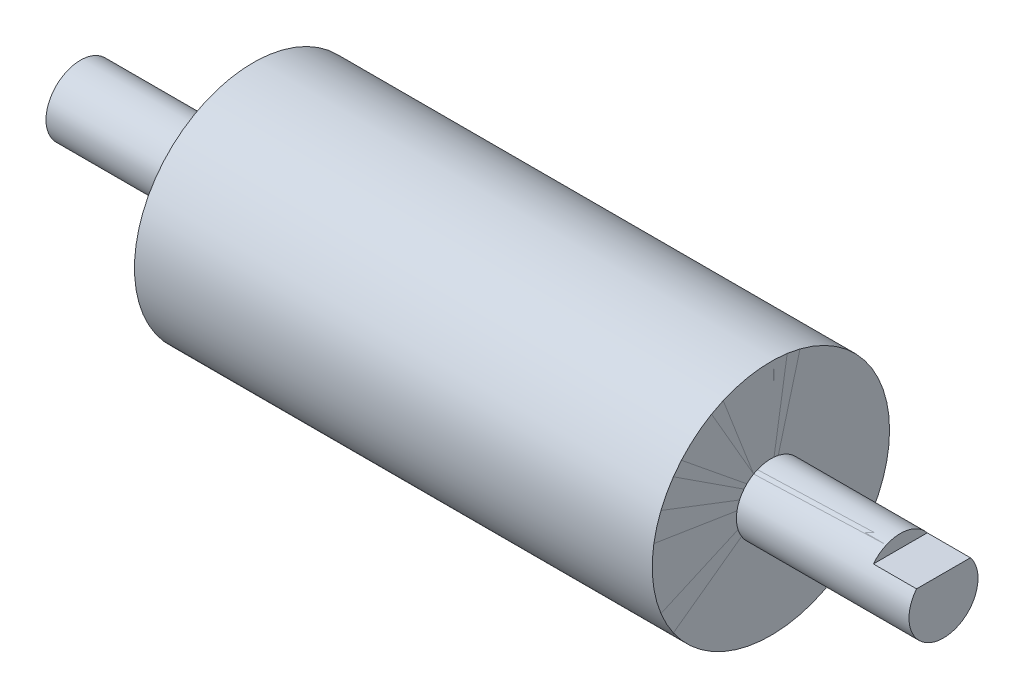
ISO-10303-21;
HEADER;
FILE_DESCRIPTION(('STEP AP214'),'2;1');
FILE_NAME('part.step','',(''),(''),'','','');
FILE_SCHEMA(('AUTOMOTIVE_DESIGN { 1 0 10303 214 1 1 1 1 }'));
ENDSEC;
DATA;
#1=APPLICATION_CONTEXT('core data for automotive mechanical design processes');
#2=APPLICATION_PROTOCOL_DEFINITION('international standard','automotive_design',2000,#1);
#3=PRODUCT_CONTEXT('',#1,'mechanical');
#4=PRODUCT('Part','Part','',(#3));
#5=PRODUCT_RELATED_PRODUCT_CATEGORY('part','',(#4));
#6=PRODUCT_DEFINITION_FORMATION('','',#4);
#7=PRODUCT_DEFINITION_CONTEXT('part definition',#1,'design');
#8=PRODUCT_DEFINITION('design','',#6,#7);
#9=PRODUCT_DEFINITION_SHAPE('','',#8);
#10=(LENGTH_UNIT() NAMED_UNIT(*) SI_UNIT(.MILLI.,.METRE.));
#11=(NAMED_UNIT(*) PLANE_ANGLE_UNIT() SI_UNIT($,.RADIAN.));
#12=(NAMED_UNIT(*) SI_UNIT($,.STERADIAN.) SOLID_ANGLE_UNIT());
#13=UNCERTAINTY_MEASURE_WITH_UNIT(LENGTH_MEASURE(1.E-05),#10,'distance_accuracy_value','');
#14=(GEOMETRIC_REPRESENTATION_CONTEXT(3) GLOBAL_UNCERTAINTY_ASSIGNED_CONTEXT((#13)) GLOBAL_UNIT_ASSIGNED_CONTEXT((#10,
#11,#12)) REPRESENTATION_CONTEXT('',''));
#15=CARTESIAN_POINT('',(0.,0.,0.));
#16=DIRECTION('',(0.,0.,1.));
#17=DIRECTION('',(1.,0.,0.));
#18=AXIS2_PLACEMENT_3D('',#15,#16,#17);
#19=CARTESIAN_POINT('',(0.,0.,0.));
#20=DIRECTION('',(1.,0.,0.));
#21=DIRECTION('',(0.,0.,-1.));
#22=AXIS2_PLACEMENT_3D('',#19,#20,#21);
#23=PLANE('',#22);
#24=CARTESIAN_POINT('',(0.,0.,0.));
#25=DIRECTION('',(1.,0.,0.));
#26=DIRECTION('',(0.,0.,-1.));
#27=AXIS2_PLACEMENT_3D('',#24,#25,#26);
#28=CIRCLE('',#27,8.);
#29=CARTESIAN_POINT('',(0.,0.,-8.));
#30=VERTEX_POINT('',#29);
#31=EDGE_CURVE('E98',#30,#30,#28,.F.);
#32=ORIENTED_EDGE('',*,*,#31,.T.);
#33=EDGE_LOOP('',(#32));
#34=FACE_BOUND('',#33,.T.);
#35=CARTESIAN_POINT('',(0.,0.,0.));
#36=DIRECTION('',(1.,0.,0.));
#37=DIRECTION('',(0.,0.,-1.));
#38=AXIS2_PLACEMENT_3D('',#35,#36,#37);
#39=CIRCLE('',#38,27.5);
#40=CARTESIAN_POINT('',(0.,0.,-27.5));
#41=VERTEX_POINT('',#40);
#42=EDGE_CURVE('E12',#41,#41,#39,.T.);
#43=ORIENTED_EDGE('',*,*,#42,.T.);
#44=EDGE_LOOP('',(#43));
#45=FACE_BOUND('',#44,.T.);
#46=ADVANCED_FACE('F53',(#34,#45),#23,.T.);
#47=CARTESIAN_POINT('',(0.,0.,0.));
#48=DIRECTION('',(1.,0.,0.));
#49=DIRECTION('',(0.,0.,-1.));
#50=AXIS2_PLACEMENT_3D('',#47,#48,#49);
#51=CYLINDRICAL_SURFACE('',#50,27.5);
#52=CARTESIAN_POINT('',(-120.,0.,0.));
#53=DIRECTION('',(1.,0.,0.));
#54=DIRECTION('',(0.,0.,-1.));
#55=AXIS2_PLACEMENT_3D('',#52,#53,#54);
#56=CIRCLE('',#55,27.5);
#57=CARTESIAN_POINT('',(-120.,0.,-27.5));
#58=VERTEX_POINT('',#57);
#59=EDGE_CURVE('E61',#58,#58,#56,.T.);
#60=ORIENTED_EDGE('',*,*,#59,.T.);
#61=EDGE_LOOP('',(#60));
#62=FACE_BOUND('',#61,.T.);
#63=ORIENTED_EDGE('',*,*,#42,.F.);
#64=EDGE_LOOP('',(#63));
#65=FACE_BOUND('',#64,.T.);
#66=ADVANCED_FACE('F104',(#62,#65),#51,.T.);
#67=CARTESIAN_POINT('',(-120.,0.,0.));
#68=DIRECTION('',(-1.,0.,0.));
#69=DIRECTION('',(0.,0.,1.));
#70=AXIS2_PLACEMENT_3D('',#67,#68,#69);
#71=PLANE('',#70);
#72=CARTESIAN_POINT('',(-120.,0.,0.));
#73=DIRECTION('',(-1.,0.,0.));
#74=DIRECTION('',(0.,0.,1.));
#75=AXIS2_PLACEMENT_3D('',#72,#73,#74);
#76=CIRCLE('',#75,8.);
#77=CARTESIAN_POINT('',(-120.,0.,8.));
#78=VERTEX_POINT('',#77);
#79=EDGE_CURVE('E56',#78,#78,#76,.F.);
#80=ORIENTED_EDGE('',*,*,#79,.T.);
#81=EDGE_LOOP('',(#80));
#82=FACE_BOUND('',#81,.T.);
#83=ORIENTED_EDGE('',*,*,#59,.F.);
#84=EDGE_LOOP('',(#83));
#85=FACE_BOUND('',#84,.T.);
#86=ADVANCED_FACE('F107',(#82,#85),#71,.T.);
#87=CARTESIAN_POINT('',(-160.,0.,0.));
#88=DIRECTION('',(-1.,0.,0.));
#89=DIRECTION('',(0.,0.,1.));
#90=AXIS2_PLACEMENT_3D('',#87,#88,#89);
#91=PLANE('',#90);
#92=CARTESIAN_POINT('',(-160.,0.,0.));
#93=DIRECTION('',(-1.,0.,0.));
#94=DIRECTION('',(0.,0.,1.));
#95=AXIS2_PLACEMENT_3D('',#92,#93,#94);
#96=CIRCLE('',#95,8.);
#97=CARTESIAN_POINT('',(-160.,0.,8.));
#98=VERTEX_POINT('',#97);
#99=EDGE_CURVE('E85',#98,#98,#96,.T.);
#100=ORIENTED_EDGE('',*,*,#99,.T.);
#101=EDGE_LOOP('',(#100));
#102=FACE_BOUND('',#101,.T.);
#103=ADVANCED_FACE('F109',(#102),#91,.T.);
#104=CARTESIAN_POINT('',(-160.,0.,0.));
#105=DIRECTION('',(1.,0.,0.));
#106=DIRECTION('',(0.,0.,-1.));
#107=AXIS2_PLACEMENT_3D('',#104,#105,#106);
#108=CYLINDRICAL_SURFACE('',#107,8.);
#109=ORIENTED_EDGE('',*,*,#79,.F.);
#110=EDGE_LOOP('',(#109));
#111=FACE_BOUND('',#110,.T.);
#112=ORIENTED_EDGE('',*,*,#99,.F.);
#113=EDGE_LOOP('',(#112));
#114=FACE_BOUND('',#113,.T.);
#115=ADVANCED_FACE('F116',(#111,#114),#108,.T.);
#116=ORIENTED_EDGE('',*,*,#31,.F.);
#117=EDGE_LOOP('',(#116));
#118=FACE_BOUND('',#117,.T.);
#119=CARTESIAN_POINT('',(30.,0.,0.));
#120=DIRECTION('',(1.,0.,0.));
#121=DIRECTION('',(0.,0.,-1.));
#122=AXIS2_PLACEMENT_3D('',#119,#120,#121);
#123=CIRCLE('',#122,8.);
#124=CARTESIAN_POINT('',(30.,5.,-6.2449979983984));
#125=VERTEX_POINT('',#124);
#126=CARTESIAN_POINT('',(30.,5.,6.2449979983984));
#127=VERTEX_POINT('',#126);
#128=EDGE_CURVE('E84',#125,#127,#123,.T.);
#129=ORIENTED_EDGE('',*,*,#128,.F.);
#130=DIRECTION('',(1.,0.,0.));
#131=VECTOR('',#130,1.);
#132=CARTESIAN_POINT('',(-160.,5.,-6.2449979983984));
#133=LINE('',#132,#131);
#134=CARTESIAN_POINT('',(40.,5.,-6.24499799839839));
#135=VERTEX_POINT('',#134);
#136=EDGE_CURVE('E73',#125,#135,#133,.T.);
#137=ORIENTED_EDGE('',*,*,#136,.T.);
#138=CARTESIAN_POINT('',(40.,0.,0.));
#139=DIRECTION('',(-1.,0.,0.));
#140=DIRECTION('',(0.,0.,1.));
#141=AXIS2_PLACEMENT_3D('',#138,#139,#140);
#142=CIRCLE('',#141,8.);
#143=CARTESIAN_POINT('',(40.,5.,6.2449979983984));
#144=VERTEX_POINT('',#143);
#145=EDGE_CURVE('E90',#135,#144,#142,.T.);
#146=ORIENTED_EDGE('',*,*,#145,.T.);
#147=DIRECTION('',(1.,0.,0.));
#148=VECTOR('',#147,1.);
#149=CARTESIAN_POINT('',(-160.,5.,6.2449979983984));
#150=LINE('',#149,#148);
#151=EDGE_CURVE('E68',#144,#127,#150,.F.);
#152=ORIENTED_EDGE('',*,*,#151,.T.);
#153=EDGE_LOOP('',(#129,#137,#146,#152));
#154=FACE_BOUND('',#153,.T.);
#155=ADVANCED_FACE('F89',(#118,#154),#108,.T.);
#156=CARTESIAN_POINT('',(40.,0.,0.));
#157=DIRECTION('',(-1.,0.,0.));
#158=DIRECTION('',(0.,0.,1.));
#159=AXIS2_PLACEMENT_3D('',#156,#157,#158);
#160=PLANE('',#159);
#161=ORIENTED_EDGE('',*,*,#145,.F.);
#162=DIRECTION('',(0.,0.,1.));
#163=VECTOR('',#162,1.);
#164=CARTESIAN_POINT('',(40.,5.,0.));
#165=LINE('',#164,#163);
#166=EDGE_CURVE('E79',#135,#144,#165,.T.);
#167=ORIENTED_EDGE('',*,*,#166,.T.);
#168=EDGE_LOOP('',(#161,#167));
#169=FACE_BOUND('',#168,.T.);
#170=ADVANCED_FACE('F92',(#169),#160,.F.);
#171=CARTESIAN_POINT('',(30.,0.,0.));
#172=DIRECTION('',(1.,0.,0.));
#173=DIRECTION('',(0.,0.,-1.));
#174=AXIS2_PLACEMENT_3D('',#171,#172,#173);
#175=PLANE('',#174);
#176=ORIENTED_EDGE('',*,*,#128,.T.);
#177=DIRECTION('',(0.,0.,-1.));
#178=VECTOR('',#177,1.);
#179=CARTESIAN_POINT('',(30.,5.,13.));
#180=LINE('',#179,#178);
#181=EDGE_CURVE('E144',#127,#125,#180,.T.);
#182=ORIENTED_EDGE('',*,*,#181,.T.);
#183=EDGE_LOOP('',(#176,#182));
#184=FACE_BOUND('',#183,.T.);
#185=ADVANCED_FACE('F134',(#184),#175,.T.);
#186=CARTESIAN_POINT('',(30.,5.,13.));
#187=DIRECTION('',(0.,-1.,0.));
#188=DIRECTION('',(0.,0.,-1.));
#189=AXIS2_PLACEMENT_3D('',#186,#187,#188);
#190=PLANE('',#189);
#191=ORIENTED_EDGE('',*,*,#181,.F.);
#192=ORIENTED_EDGE('',*,*,#151,.F.);
#193=ORIENTED_EDGE('',*,*,#166,.F.);
#194=ORIENTED_EDGE('',*,*,#136,.F.);
#195=EDGE_LOOP('',(#191,#192,#193,#194));
#196=FACE_BOUND('',#195,.T.);
#197=ADVANCED_FACE('F80',(#196),#190,.F.);
#198=CLOSED_SHELL('',(#46,#66,#86,#103,#115,#155,#170,#185,#197));
#199=MANIFOLD_SOLID_BREP('B2_NOT_SHOWN',#198);
#200=CARTESIAN_POINT('',(-160.,0.,0.));
#201=DIRECTION('',(1.,0.,0.));
#202=DIRECTION('',(0.,0.,-1.));
#203=AXIS2_PLACEMENT_3D('',#200,#201,#202);
#204=CYLINDRICAL_SURFACE('',#203,8.);
#205=CARTESIAN_POINT('',(0.,0.,0.));
#206=DIRECTION('',(1.,0.,0.));
#207=DIRECTION('',(0.,0.,-1.));
#208=AXIS2_PLACEMENT_3D('',#205,#206,#207);
#209=CIRCLE('',#208,8.);
#210=CARTESIAN_POINT('',(0.,0.,-8.));
#211=VERTEX_POINT('',#210);
#212=EDGE_CURVE('E211',#211,#211,#209,.T.);
#213=ORIENTED_EDGE('',*,*,#212,.T.);
#214=EDGE_LOOP('',(#213));
#215=FACE_BOUND('',#214,.T.);
#216=CARTESIAN_POINT('',(30.,0.,0.));
#217=DIRECTION('',(1.,0.,0.));
#218=DIRECTION('',(0.,0.,-1.));
#219=AXIS2_PLACEMENT_3D('',#216,#217,#218);
#220=CIRCLE('',#219,8.);
#221=CARTESIAN_POINT('',(30.,5.,-6.2449979983984));
#222=VERTEX_POINT('',#221);
#223=CARTESIAN_POINT('',(30.,5.,6.2449979983984));
#224=VERTEX_POINT('',#223);
#225=EDGE_CURVE('E51',#222,#224,#220,.T.);
#226=ORIENTED_EDGE('',*,*,#225,.F.);
#227=DIRECTION('',(1.,0.,0.));
#228=VECTOR('',#227,1.);
#229=CARTESIAN_POINT('',(-160.,5.,-6.2449979983984));
#230=LINE('',#229,#228);
#231=CARTESIAN_POINT('',(40.,5.,-6.24499799839839));
#232=VERTEX_POINT('',#231);
#233=EDGE_CURVE('E229',#222,#232,#230,.T.);
#234=ORIENTED_EDGE('',*,*,#233,.T.);
#235=CARTESIAN_POINT('',(40.,0.,0.));
#236=DIRECTION('',(-1.,0.,0.));
#237=DIRECTION('',(0.,0.,1.));
#238=AXIS2_PLACEMENT_3D('',#235,#236,#237);
#239=CIRCLE('',#238,8.);
#240=CARTESIAN_POINT('',(40.,5.,6.2449979983984));
#241=VERTEX_POINT('',#240);
#242=EDGE_CURVE('E242',#232,#241,#239,.T.);
#243=ORIENTED_EDGE('',*,*,#242,.T.);
#244=DIRECTION('',(1.,0.,0.));
#245=VECTOR('',#244,1.);
#246=CARTESIAN_POINT('',(-160.,5.,6.2449979983984));
#247=LINE('',#246,#245);
#248=EDGE_CURVE('E224',#241,#224,#247,.F.);
#249=ORIENTED_EDGE('',*,*,#248,.T.);
#250=EDGE_LOOP('',(#226,#234,#243,#249));
#251=FACE_BOUND('',#250,.T.);
#252=ADVANCED_FACE('F207',(#215,#251),#204,.T.);
#253=CARTESIAN_POINT('',(40.,0.,0.));
#254=DIRECTION('',(-1.,0.,0.));
#255=DIRECTION('',(0.,0.,1.));
#256=AXIS2_PLACEMENT_3D('',#253,#254,#255);
#257=PLANE('',#256);
#258=ORIENTED_EDGE('',*,*,#242,.F.);
#259=DIRECTION('',(0.,0.,1.));
#260=VECTOR('',#259,1.);
#261=CARTESIAN_POINT('',(40.,5.,0.));
#262=LINE('',#261,#260);
#263=EDGE_CURVE('E216',#232,#241,#262,.T.);
#264=ORIENTED_EDGE('',*,*,#263,.T.);
#265=EDGE_LOOP('',(#258,#264));
#266=FACE_BOUND('',#265,.T.);
#267=ADVANCED_FACE('F244',(#266),#257,.F.);
#268=CARTESIAN_POINT('',(30.,0.,0.));
#269=DIRECTION('',(1.,0.,0.));
#270=DIRECTION('',(0.,0.,-1.));
#271=AXIS2_PLACEMENT_3D('',#268,#269,#270);
#272=PLANE('',#271);
#273=ORIENTED_EDGE('',*,*,#225,.T.);
#274=DIRECTION('',(0.,0.,-1.));
#275=VECTOR('',#274,1.);
#276=CARTESIAN_POINT('',(30.,5.,13.));
#277=LINE('',#276,#275);
#278=EDGE_CURVE('E254',#224,#222,#277,.T.);
#279=ORIENTED_EDGE('',*,*,#278,.T.);
#280=EDGE_LOOP('',(#273,#279));
#281=FACE_BOUND('',#280,.T.);
#282=ADVANCED_FACE('F266',(#281),#272,.T.);
#283=CARTESIAN_POINT('',(30.,5.,13.));
#284=DIRECTION('',(0.,-1.,0.));
#285=DIRECTION('',(0.,0.,-1.));
#286=AXIS2_PLACEMENT_3D('',#283,#284,#285);
#287=PLANE('',#286);
#288=ORIENTED_EDGE('',*,*,#278,.F.);
#289=ORIENTED_EDGE('',*,*,#248,.F.);
#290=ORIENTED_EDGE('',*,*,#263,.F.);
#291=ORIENTED_EDGE('',*,*,#233,.F.);
#292=EDGE_LOOP('',(#288,#289,#290,#291));
#293=FACE_BOUND('',#292,.T.);
#294=ADVANCED_FACE('F234',(#293),#287,.F.);
#295=CARTESIAN_POINT('',(0.,27.5,0.));
#296=DIRECTION('',(1.,0.,0.));
#297=DIRECTION('',(0.,0.,-1.));
#298=AXIS2_PLACEMENT_3D('',#295,#296,#297);
#299=PLANE('',#298);
#300=ORIENTED_EDGE('',*,*,#212,.F.);
#301=EDGE_LOOP('',(#300));
#302=FACE_BOUND('',#301,.T.);
#303=CARTESIAN_POINT('',(0.,0.,0.));
#304=DIRECTION('',(1.,0.,0.));
#305=DIRECTION('',(0.,0.,-1.));
#306=AXIS2_PLACEMENT_3D('',#303,#304,#305);
#307=CIRCLE('',#306,27.5);
#308=CARTESIAN_POINT('',(0.,0.,-27.5));
#309=VERTEX_POINT('',#308);
#310=EDGE_CURVE('E256',#309,#309,#307,.T.);
#311=ORIENTED_EDGE('',*,*,#310,.T.);
#312=EDGE_LOOP('',(#311));
#313=FACE_BOUND('',#312,.T.);
#314=ADVANCED_FACE('F273',(#302,#313),#299,.T.);
#315=CARTESIAN_POINT('',(-120.,0.,0.));
#316=DIRECTION('',(-1.,0.,0.));
#317=DIRECTION('',(0.,0.,1.));
#318=AXIS2_PLACEMENT_3D('',#315,#316,#317);
#319=PLANE('',#318);
#320=CARTESIAN_POINT('',(-120.,0.,0.));
#321=DIRECTION('',(-1.,0.,0.));
#322=DIRECTION('',(0.,0.,1.));
#323=AXIS2_PLACEMENT_3D('',#320,#321,#322);
#324=CIRCLE('',#323,8.);
#325=CARTESIAN_POINT('',(-120.,0.,8.));
#326=VERTEX_POINT('',#325);
#327=EDGE_CURVE('E248',#326,#326,#324,.T.);
#328=ORIENTED_EDGE('',*,*,#327,.F.);
#329=EDGE_LOOP('',(#328));
#330=FACE_BOUND('',#329,.T.);
#331=CARTESIAN_POINT('',(-120.,0.,0.));
#332=DIRECTION('',(1.,0.,0.));
#333=DIRECTION('',(0.,0.,-1.));
#334=AXIS2_PLACEMENT_3D('',#331,#332,#333);
#335=CIRCLE('',#334,27.5);
#336=CARTESIAN_POINT('',(-120.,0.,-27.5));
#337=VERTEX_POINT('',#336);
#338=EDGE_CURVE('E250',#337,#337,#335,.T.);
#339=ORIENTED_EDGE('',*,*,#338,.F.);
#340=EDGE_LOOP('',(#339));
#341=FACE_BOUND('',#340,.T.);
#342=ADVANCED_FACE('F293',(#330,#341),#319,.T.);
#343=CARTESIAN_POINT('',(0.,27.5,0.));
#344=CARTESIAN_POINT('',(-40.0082930565252,22.5461303363001,0.));
#345=CARTESIAN_POINT('',(-80.0082930565251,22.5461303363002,0.));
#346=CARTESIAN_POINT('',(-120.,27.5,0.));
#347=B_SPLINE_CURVE_WITH_KNOTS('',3,(#343,#344,#345,#346),.UNSPECIFIED.,.F.,.F.,(4,4),(0.,1.),.UNSPECIFIED.);
#348=CARTESIAN_POINT('',(-120.,0.,0.));
#349=DIRECTION('',(1.,0.,0.));
#350=AXIS1_PLACEMENT('',#348,#349);
#351=SURFACE_OF_REVOLUTION('',#347,#350);
#352=ORIENTED_EDGE('',*,*,#338,.T.);
#353=EDGE_LOOP('',(#352));
#354=FACE_BOUND('',#353,.T.);
#355=ORIENTED_EDGE('',*,*,#310,.F.);
#356=EDGE_LOOP('',(#355));
#357=FACE_BOUND('',#356,.T.);
#358=ADVANCED_FACE('F285',(#354,#357),#351,.F.);
#359=CARTESIAN_POINT('',(-160.,0.,0.));
#360=DIRECTION('',(-1.,0.,0.));
#361=DIRECTION('',(0.,0.,1.));
#362=AXIS2_PLACEMENT_3D('',#359,#360,#361);
#363=PLANE('',#362);
#364=CARTESIAN_POINT('',(-160.,0.,0.));
#365=DIRECTION('',(-1.,0.,0.));
#366=DIRECTION('',(0.,0.,1.));
#367=AXIS2_PLACEMENT_3D('',#364,#365,#366);
#368=CIRCLE('',#367,8.);
#369=CARTESIAN_POINT('',(-160.,0.,8.));
#370=VERTEX_POINT('',#369);
#371=EDGE_CURVE('E238',#370,#370,#368,.T.);
#372=ORIENTED_EDGE('',*,*,#371,.T.);
#373=EDGE_LOOP('',(#372));
#374=FACE_BOUND('',#373,.T.);
#375=ADVANCED_FACE('F281',(#374),#363,.T.);
#376=ORIENTED_EDGE('',*,*,#327,.T.);
#377=EDGE_LOOP('',(#376));
#378=FACE_BOUND('',#377,.T.);
#379=ORIENTED_EDGE('',*,*,#371,.F.);
#380=EDGE_LOOP('',(#379));
#381=FACE_BOUND('',#380,.T.);
#382=ADVANCED_FACE('F209',(#378,#381),#204,.T.);
#383=CLOSED_SHELL('',(#252,#267,#282,#294,#314,#342,#358,#375,#382));
#384=MANIFOLD_SOLID_BREP('B6',#383);
#385=ADVANCED_BREP_SHAPE_REPRESENTATION('',(#18,#199,#384),#14);
#386=SHAPE_DEFINITION_REPRESENTATION(#9,#385);
ENDSEC;
END-ISO-10303-21;
